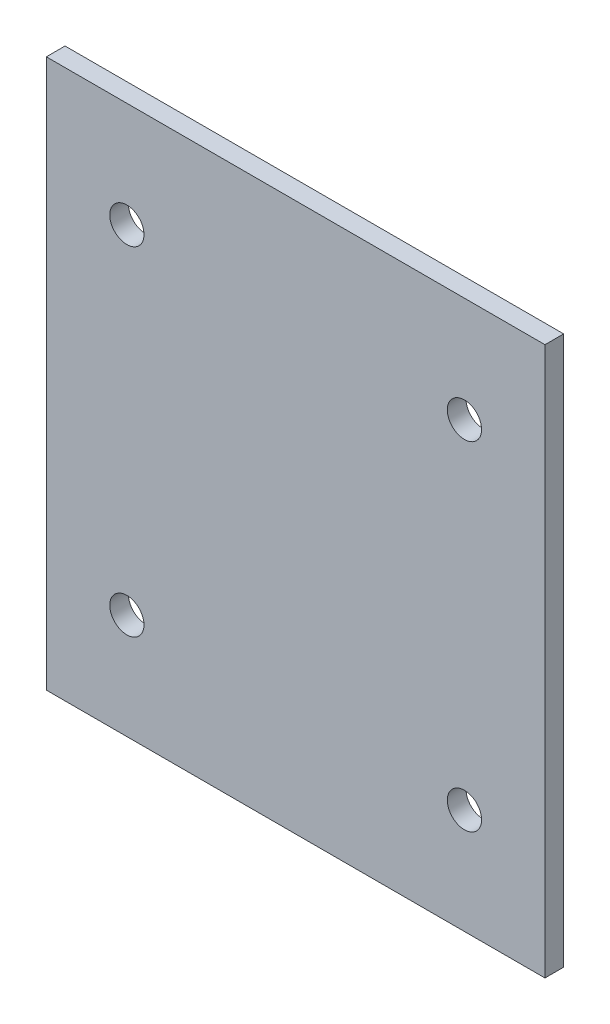
ISO-10303-21;
HEADER;
FILE_DESCRIPTION(('STEP AP214'),'2;1');
FILE_NAME('part.step','',(''),(''),'','','');
FILE_SCHEMA(('AUTOMOTIVE_DESIGN { 1 0 10303 214 1 1 1 1 }'));
ENDSEC;
DATA;
#1=APPLICATION_CONTEXT('core data for automotive mechanical design processes');
#2=APPLICATION_PROTOCOL_DEFINITION('international standard','automotive_design',2000,#1);
#3=PRODUCT_CONTEXT('',#1,'mechanical');
#4=PRODUCT('Part','Part','',(#3));
#5=PRODUCT_RELATED_PRODUCT_CATEGORY('part','',(#4));
#6=PRODUCT_DEFINITION_FORMATION('','',#4);
#7=PRODUCT_DEFINITION_CONTEXT('part definition',#1,'design');
#8=PRODUCT_DEFINITION('design','',#6,#7);
#9=PRODUCT_DEFINITION_SHAPE('','',#8);
#10=(LENGTH_UNIT() NAMED_UNIT(*) SI_UNIT(.MILLI.,.METRE.));
#11=(NAMED_UNIT(*) PLANE_ANGLE_UNIT() SI_UNIT($,.RADIAN.));
#12=(NAMED_UNIT(*) SI_UNIT($,.STERADIAN.) SOLID_ANGLE_UNIT());
#13=UNCERTAINTY_MEASURE_WITH_UNIT(LENGTH_MEASURE(1.E-05),#10,'distance_accuracy_value','');
#14=(GEOMETRIC_REPRESENTATION_CONTEXT(3) GLOBAL_UNCERTAINTY_ASSIGNED_CONTEXT((#13)) GLOBAL_UNIT_ASSIGNED_CONTEXT((#10,
#11,#12)) REPRESENTATION_CONTEXT('',''));
#15=CARTESIAN_POINT('',(0.,0.,0.));
#16=DIRECTION('',(0.,0.,1.));
#17=DIRECTION('',(1.,0.,0.));
#18=AXIS2_PLACEMENT_3D('',#15,#16,#17);
#19=CARTESIAN_POINT('',(127.000000000001,-139.700000000001,9.52499999999924));
#20=DIRECTION('',(-1.00000000000001,0.,0.));
#21=DIRECTION('',(0.,0.,1.00000000000001));
#22=AXIS2_PLACEMENT_3D('',#19,#20,#21);
#23=PLANE('',#22);
#24=DIRECTION('',(0.,1.00000000000001,0.));
#25=VECTOR('',#24,1.);
#26=CARTESIAN_POINT('',(127.000000000001,-139.700000000001,-7.63278329429795E-13));
#27=LINE('',#26,#25);
#28=CARTESIAN_POINT('',(127.000000000001,-139.700000000001,-7.63278329429795E-13));
#29=VERTEX_POINT('',#28);
#30=CARTESIAN_POINT('',(127.000000000001,139.7,-5.68989300120393E-13));
#31=VERTEX_POINT('',#30);
#32=EDGE_CURVE('E109',#29,#31,#27,.T.);
#33=ORIENTED_EDGE('',*,*,#32,.T.);
#34=DIRECTION('',(0.,0.,-1.00000000000001));
#35=VECTOR('',#34,1.);
#36=CARTESIAN_POINT('',(127.000000000001,139.7,9.52499999999976));
#37=LINE('',#36,#35);
#38=CARTESIAN_POINT('',(127.000000000001,139.7,9.52499999999976));
#39=VERTEX_POINT('',#38);
#40=EDGE_CURVE('E11',#39,#31,#37,.T.);
#41=ORIENTED_EDGE('',*,*,#40,.F.);
#42=DIRECTION('',(0.,1.00000000000001,0.));
#43=VECTOR('',#42,1.);
#44=CARTESIAN_POINT('',(127.000000000001,-139.700000000001,9.52499999999924));
#45=LINE('',#44,#43);
#46=CARTESIAN_POINT('',(127.000000000001,-139.700000000001,9.52499999999924));
#47=VERTEX_POINT('',#46);
#48=EDGE_CURVE('E92',#47,#39,#45,.T.);
#49=ORIENTED_EDGE('',*,*,#48,.F.);
#50=DIRECTION('',(0.,0.,-1.00000000000001));
#51=VECTOR('',#50,1.);
#52=CARTESIAN_POINT('',(127.000000000001,-139.700000000001,9.52499999999924));
#53=LINE('',#52,#51);
#54=EDGE_CURVE('E105',#47,#29,#53,.T.);
#55=ORIENTED_EDGE('',*,*,#54,.T.);
#56=EDGE_LOOP('',(#33,#41,#49,#55));
#57=FACE_BOUND('',#56,.T.);
#58=ADVANCED_FACE('F40',(#57),#23,.F.);
#59=CARTESIAN_POINT('',(-127.,139.700000000003,9.52500000000012));
#60=DIRECTION('',(0.,-1.00000000000001,0.));
#61=DIRECTION('',(0.,0.,-1.00000000000001));
#62=AXIS2_PLACEMENT_3D('',#59,#60,#61);
#63=PLANE('',#62);
#64=DIRECTION('',(-1.00000000000001,0.,0.));
#65=VECTOR('',#64,1.);
#66=CARTESIAN_POINT('',(-127.,139.700000000003,1.80411241501588E-13));
#67=LINE('',#66,#65);
#68=CARTESIAN_POINT('',(-127.,139.700000000003,1.80411241501588E-13));
#69=VERTEX_POINT('',#68);
#70=EDGE_CURVE('E97',#31,#69,#67,.T.);
#71=ORIENTED_EDGE('',*,*,#70,.T.);
#72=DIRECTION('',(0.,0.,-1.00000000000001));
#73=VECTOR('',#72,1.);
#74=CARTESIAN_POINT('',(-127.,139.700000000003,9.52500000000012));
#75=LINE('',#74,#73);
#76=CARTESIAN_POINT('',(-127.,139.700000000003,9.52500000000012));
#77=VERTEX_POINT('',#76);
#78=EDGE_CURVE('E49',#77,#69,#75,.T.);
#79=ORIENTED_EDGE('',*,*,#78,.F.);
#80=DIRECTION('',(-1.00000000000001,0.,0.));
#81=VECTOR('',#80,1.);
#82=CARTESIAN_POINT('',(-127.,139.700000000003,9.52500000000012));
#83=LINE('',#82,#81);
#84=EDGE_CURVE('E87',#39,#77,#83,.T.);
#85=ORIENTED_EDGE('',*,*,#84,.F.);
#86=ORIENTED_EDGE('',*,*,#40,.T.);
#87=EDGE_LOOP('',(#71,#79,#85,#86));
#88=FACE_BOUND('',#87,.T.);
#89=ADVANCED_FACE('F96',(#88),#63,.F.);
#90=CARTESIAN_POINT('',(-127.,-139.700000000001,9.5250000000001));
#91=DIRECTION('',(1.00000000000001,0.,0.));
#92=DIRECTION('',(0.,0.,-1.00000000000001));
#93=AXIS2_PLACEMENT_3D('',#90,#91,#92);
#94=PLANE('',#93);
#95=DIRECTION('',(0.,-1.00000000000001,0.));
#96=VECTOR('',#95,1.);
#97=CARTESIAN_POINT('',(-127.,-139.700000000001,2.91433543964104E-13));
#98=LINE('',#97,#96);
#99=CARTESIAN_POINT('',(-127.,-139.700000000001,2.91433543964104E-13));
#100=VERTEX_POINT('',#99);
#101=EDGE_CURVE('E74',#69,#100,#98,.T.);
#102=ORIENTED_EDGE('',*,*,#101,.T.);
#103=DIRECTION('',(0.,0.,-1.00000000000001));
#104=VECTOR('',#103,1.);
#105=CARTESIAN_POINT('',(-127.,-139.700000000001,9.5250000000001));
#106=LINE('',#105,#104);
#107=CARTESIAN_POINT('',(-127.,-139.700000000001,9.5250000000001));
#108=VERTEX_POINT('',#107);
#109=EDGE_CURVE('E99',#108,#100,#106,.T.);
#110=ORIENTED_EDGE('',*,*,#109,.F.);
#111=DIRECTION('',(0.,-1.00000000000001,0.));
#112=VECTOR('',#111,1.);
#113=CARTESIAN_POINT('',(-127.,-139.700000000001,9.5250000000001));
#114=LINE('',#113,#112);
#115=EDGE_CURVE('E90',#77,#108,#114,.T.);
#116=ORIENTED_EDGE('',*,*,#115,.F.);
#117=ORIENTED_EDGE('',*,*,#78,.T.);
#118=EDGE_LOOP('',(#102,#110,#116,#117));
#119=FACE_BOUND('',#118,.T.);
#120=ADVANCED_FACE('F100',(#119),#94,.F.);
#121=CARTESIAN_POINT('',(-127.,-139.700000000001,9.5250000000001));
#122=DIRECTION('',(0.,1.00000000000001,0.));
#123=DIRECTION('',(0.,0.,1.00000000000001));
#124=AXIS2_PLACEMENT_3D('',#121,#122,#123);
#125=PLANE('',#124);
#126=DIRECTION('',(1.00000000000001,0.,0.));
#127=VECTOR('',#126,1.);
#128=CARTESIAN_POINT('',(-127.,-139.700000000001,2.91433543964104E-13));
#129=LINE('',#128,#127);
#130=EDGE_CURVE('E80',#100,#29,#129,.T.);
#131=ORIENTED_EDGE('',*,*,#130,.T.);
#132=ORIENTED_EDGE('',*,*,#54,.F.);
#133=DIRECTION('',(1.00000000000001,0.,0.));
#134=VECTOR('',#133,1.);
#135=CARTESIAN_POINT('',(-127.,-139.700000000001,9.5250000000001));
#136=LINE('',#135,#134);
#137=EDGE_CURVE('E57',#108,#47,#136,.T.);
#138=ORIENTED_EDGE('',*,*,#137,.F.);
#139=ORIENTED_EDGE('',*,*,#109,.T.);
#140=EDGE_LOOP('',(#131,#132,#138,#139));
#141=FACE_BOUND('',#140,.T.);
#142=ADVANCED_FACE('F124',(#141),#125,.F.);
#143=CARTESIAN_POINT('',(0.,0.,9.5250000000001));
#144=DIRECTION('',(0.,0.,-1.00000000000001));
#145=DIRECTION('',(-1.00000000000001,0.,0.));
#146=AXIS2_PLACEMENT_3D('',#143,#144,#145);
#147=PLANE('',#146);
#148=CARTESIAN_POINT('',(-85.9790000000008,86.1060000000013,9.52500000000081));
#149=DIRECTION('',(0.,0.,1.00000000000001));
#150=DIRECTION('',(1.00000000000001,0.,0.));
#151=AXIS2_PLACEMENT_3D('',#148,#149,#150);
#152=CIRCLE('',#151,8.72489999999997);
#153=CARTESIAN_POINT('',(-77.2541000000008,86.1060000000013,9.52500000000077));
#154=VERTEX_POINT('',#153);
#155=EDGE_CURVE('E159',#154,#154,#152,.T.);
#156=ORIENTED_EDGE('',*,*,#155,.F.);
#157=EDGE_LOOP('',(#156));
#158=FACE_BOUND('',#157,.T.);
#159=CARTESIAN_POINT('',(-85.9790000000005,-86.106,9.52500000000056));
#160=DIRECTION('',(0.,0.,1.00000000000001));
#161=DIRECTION('',(1.00000000000001,0.,0.));
#162=AXIS2_PLACEMENT_3D('',#159,#160,#161);
#163=CIRCLE('',#162,8.72489999999997);
#164=CARTESIAN_POINT('',(-77.2541000000005,-86.106,9.52500000000052));
#165=VERTEX_POINT('',#164);
#166=EDGE_CURVE('E151',#165,#165,#163,.T.);
#167=ORIENTED_EDGE('',*,*,#166,.F.);
#168=EDGE_LOOP('',(#167));
#169=FACE_BOUND('',#168,.T.);
#170=CARTESIAN_POINT('',(85.9790000000012,-86.106,9.52499999999977));
#171=DIRECTION('',(0.,0.,1.00000000000001));
#172=DIRECTION('',(1.00000000000001,0.,0.));
#173=AXIS2_PLACEMENT_3D('',#170,#171,#172);
#174=CIRCLE('',#173,8.72489999999997);
#175=CARTESIAN_POINT('',(94.7039000000012,-86.106,9.52499999999973));
#176=VERTEX_POINT('',#175);
#177=EDGE_CURVE('E143',#176,#176,#174,.T.);
#178=ORIENTED_EDGE('',*,*,#177,.F.);
#179=EDGE_LOOP('',(#178));
#180=FACE_BOUND('',#179,.T.);
#181=CARTESIAN_POINT('',(85.979000000001,86.1060000000026,9.52499999999944));
#182=DIRECTION('',(0.,0.,1.00000000000001));
#183=DIRECTION('',(1.00000000000001,0.,0.));
#184=AXIS2_PLACEMENT_3D('',#181,#182,#183);
#185=CIRCLE('',#184,8.72489999999997);
#186=CARTESIAN_POINT('',(94.703900000001,86.1060000000026,9.52499999999939));
#187=VERTEX_POINT('',#186);
#188=EDGE_CURVE('E135',#187,#187,#185,.T.);
#189=ORIENTED_EDGE('',*,*,#188,.F.);
#190=EDGE_LOOP('',(#189));
#191=FACE_BOUND('',#190,.T.);
#192=ORIENTED_EDGE('',*,*,#48,.T.);
#193=ORIENTED_EDGE('',*,*,#84,.T.);
#194=ORIENTED_EDGE('',*,*,#115,.T.);
#195=ORIENTED_EDGE('',*,*,#137,.T.);
#196=EDGE_LOOP('',(#192,#193,#194,#195));
#197=FACE_BOUND('',#196,.T.);
#198=ADVANCED_FACE('F88',(#158,#169,#180,#191,#197),#147,.F.);
#199=CARTESIAN_POINT('',(0.,0.,0.));
#200=DIRECTION('',(0.,0.,-1.00000000000001));
#201=DIRECTION('',(-1.00000000000001,0.,0.));
#202=AXIS2_PLACEMENT_3D('',#199,#200,#201);
#203=PLANE('',#202);
#204=CARTESIAN_POINT('',(-85.9790000000008,86.1060000000013,5.55111512312578E-13));
#205=DIRECTION('',(0.,0.,1.00000000000001));
#206=DIRECTION('',(1.00000000000001,0.,0.));
#207=AXIS2_PLACEMENT_3D('',#204,#205,#206);
#208=CIRCLE('',#207,8.72489999999997);
#209=CARTESIAN_POINT('',(-77.2541000000008,86.1060000000013,5.10068892678461E-13));
#210=VERTEX_POINT('',#209);
#211=EDGE_CURVE('E155',#210,#210,#208,.T.);
#212=ORIENTED_EDGE('',*,*,#211,.T.);
#213=EDGE_LOOP('',(#212));
#214=FACE_BOUND('',#213,.T.);
#215=CARTESIAN_POINT('',(-85.9790000000007,-86.106,5.96744875736022E-13));
#216=DIRECTION('',(0.,0.,1.00000000000001));
#217=DIRECTION('',(1.00000000000001,0.,0.));
#218=AXIS2_PLACEMENT_3D('',#215,#216,#217);
#219=CIRCLE('',#218,8.72489999999997);
#220=CARTESIAN_POINT('',(-77.2541000000006,-86.106,5.51702256101905E-13));
#221=VERTEX_POINT('',#220);
#222=EDGE_CURVE('E147',#221,#221,#219,.T.);
#223=ORIENTED_EDGE('',*,*,#222,.T.);
#224=EDGE_LOOP('',(#223));
#225=FACE_BOUND('',#224,.T.);
#226=CARTESIAN_POINT('',(85.9790000000013,-86.106,-3.19189119579733E-13));
#227=DIRECTION('',(0.,0.,1.00000000000001));
#228=DIRECTION('',(1.00000000000001,0.,0.));
#229=AXIS2_PLACEMENT_3D('',#226,#227,#228);
#230=CIRCLE('',#229,8.72489999999997);
#231=CARTESIAN_POINT('',(94.7039000000013,-86.106,-3.64231739213849E-13));
#232=VERTEX_POINT('',#231);
#233=EDGE_CURVE('E139',#232,#232,#230,.T.);
#234=ORIENTED_EDGE('',*,*,#233,.T.);
#235=EDGE_LOOP('',(#234));
#236=FACE_BOUND('',#235,.T.);
#237=CARTESIAN_POINT('',(85.9790000000013,86.1060000000013,-5.41233724504764E-13));
#238=DIRECTION('',(0.,0.,1.00000000000001));
#239=DIRECTION('',(1.00000000000001,0.,0.));
#240=AXIS2_PLACEMENT_3D('',#237,#238,#239);
#241=CIRCLE('',#240,8.72489999999997);
#242=CARTESIAN_POINT('',(94.7039000000013,86.1060000000013,-5.86276344138881E-13));
#243=VERTEX_POINT('',#242);
#244=EDGE_CURVE('E113',#243,#243,#241,.T.);
#245=ORIENTED_EDGE('',*,*,#244,.T.);
#246=EDGE_LOOP('',(#245));
#247=FACE_BOUND('',#246,.T.);
#248=ORIENTED_EDGE('',*,*,#32,.F.);
#249=ORIENTED_EDGE('',*,*,#130,.F.);
#250=ORIENTED_EDGE('',*,*,#101,.F.);
#251=ORIENTED_EDGE('',*,*,#70,.F.);
#252=EDGE_LOOP('',(#248,#249,#250,#251));
#253=FACE_BOUND('',#252,.T.);
#254=ADVANCED_FACE('F127',(#214,#225,#236,#247,#253),#203,.T.);
#255=CARTESIAN_POINT('',(85.979000000001,86.1060000000026,9.52499999999944));
#256=DIRECTION('',(0.,0.,1.00000000000001));
#257=DIRECTION('',(1.00000000000001,0.,0.));
#258=AXIS2_PLACEMENT_3D('',#255,#256,#257);
#259=CYLINDRICAL_SURFACE('',#258,8.72489999999997);
#260=ORIENTED_EDGE('',*,*,#244,.F.);
#261=EDGE_LOOP('',(#260));
#262=FACE_BOUND('',#261,.T.);
#263=ORIENTED_EDGE('',*,*,#188,.T.);
#264=EDGE_LOOP('',(#263));
#265=FACE_BOUND('',#264,.T.);
#266=ADVANCED_FACE('F176',(#262,#265),#259,.F.);
#267=CARTESIAN_POINT('',(85.9790000000012,-86.106,9.52499999999977));
#268=DIRECTION('',(0.,0.,1.00000000000001));
#269=DIRECTION('',(1.00000000000001,0.,0.));
#270=AXIS2_PLACEMENT_3D('',#267,#268,#269);
#271=CYLINDRICAL_SURFACE('',#270,8.72489999999997);
#272=ORIENTED_EDGE('',*,*,#233,.F.);
#273=EDGE_LOOP('',(#272));
#274=FACE_BOUND('',#273,.T.);
#275=ORIENTED_EDGE('',*,*,#177,.T.);
#276=EDGE_LOOP('',(#275));
#277=FACE_BOUND('',#276,.T.);
#278=ADVANCED_FACE('F178',(#274,#277),#271,.F.);
#279=CARTESIAN_POINT('',(-85.9790000000005,-86.106,9.52500000000056));
#280=DIRECTION('',(0.,0.,1.00000000000001));
#281=DIRECTION('',(1.00000000000001,0.,0.));
#282=AXIS2_PLACEMENT_3D('',#279,#280,#281);
#283=CYLINDRICAL_SURFACE('',#282,8.72489999999997);
#284=ORIENTED_EDGE('',*,*,#222,.F.);
#285=EDGE_LOOP('',(#284));
#286=FACE_BOUND('',#285,.T.);
#287=ORIENTED_EDGE('',*,*,#166,.T.);
#288=EDGE_LOOP('',(#287));
#289=FACE_BOUND('',#288,.T.);
#290=ADVANCED_FACE('F185',(#286,#289),#283,.F.);
#291=CARTESIAN_POINT('',(-85.9790000000008,86.1060000000013,9.52500000000081));
#292=DIRECTION('',(0.,0.,1.00000000000001));
#293=DIRECTION('',(1.00000000000001,0.,0.));
#294=AXIS2_PLACEMENT_3D('',#291,#292,#293);
#295=CYLINDRICAL_SURFACE('',#294,8.72489999999997);
#296=ORIENTED_EDGE('',*,*,#211,.F.);
#297=EDGE_LOOP('',(#296));
#298=FACE_BOUND('',#297,.T.);
#299=ORIENTED_EDGE('',*,*,#155,.T.);
#300=EDGE_LOOP('',(#299));
#301=FACE_BOUND('',#300,.T.);
#302=ADVANCED_FACE('F165',(#298,#301),#295,.F.);
#303=CLOSED_SHELL('',(#58,#89,#120,#142,#198,#254,#266,#278,#290,#302));
#304=MANIFOLD_SOLID_BREP('B2',#303);
#305=ADVANCED_BREP_SHAPE_REPRESENTATION('',(#18,#304),#14);
#306=SHAPE_DEFINITION_REPRESENTATION(#9,#305);
ENDSEC;
END-ISO-10303-21;
